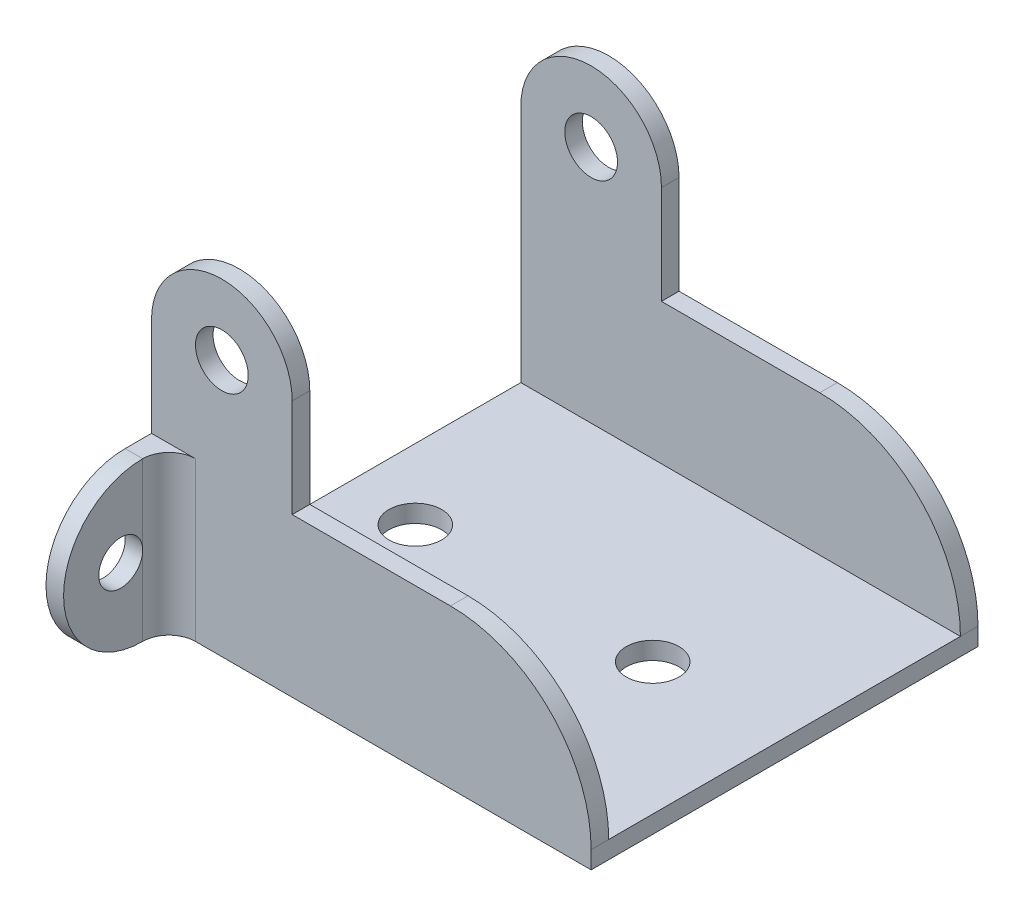
ISO-10303-21;
HEADER;
FILE_DESCRIPTION(('STEP AP214'),'2;1');
FILE_NAME('part.step','',(''),(''),'','','');
FILE_SCHEMA(('AUTOMOTIVE_DESIGN { 1 0 10303 214 1 1 1 1 }'));
ENDSEC;
DATA;
#1=APPLICATION_CONTEXT('core data for automotive mechanical design processes');
#2=APPLICATION_PROTOCOL_DEFINITION('international standard','automotive_design',2000,#1);
#3=PRODUCT_CONTEXT('',#1,'mechanical');
#4=PRODUCT('Part','Part','',(#3));
#5=PRODUCT_RELATED_PRODUCT_CATEGORY('part','',(#4));
#6=PRODUCT_DEFINITION_FORMATION('','',#4);
#7=PRODUCT_DEFINITION_CONTEXT('part definition',#1,'design');
#8=PRODUCT_DEFINITION('design','',#6,#7);
#9=PRODUCT_DEFINITION_SHAPE('','',#8);
#10=(LENGTH_UNIT() NAMED_UNIT(*) SI_UNIT(.MILLI.,.METRE.));
#11=(NAMED_UNIT(*) PLANE_ANGLE_UNIT() SI_UNIT($,.RADIAN.));
#12=(NAMED_UNIT(*) SI_UNIT($,.STERADIAN.) SOLID_ANGLE_UNIT());
#13=UNCERTAINTY_MEASURE_WITH_UNIT(LENGTH_MEASURE(1.E-05),#10,'distance_accuracy_value','');
#14=(GEOMETRIC_REPRESENTATION_CONTEXT(3) GLOBAL_UNCERTAINTY_ASSIGNED_CONTEXT((#13)) GLOBAL_UNIT_ASSIGNED_CONTEXT((#10,
#11,#12)) REPRESENTATION_CONTEXT('',''));
#15=CARTESIAN_POINT('',(0.,0.,0.));
#16=DIRECTION('',(0.,0.,1.));
#17=DIRECTION('',(1.,0.,0.));
#18=AXIS2_PLACEMENT_3D('',#15,#16,#17);
#19=CARTESIAN_POINT('',(-12.5,4.5,12.5));
#20=DIRECTION('',(-1.,0.,0.));
#21=DIRECTION('',(0.,0.,1.));
#22=AXIS2_PLACEMENT_3D('',#19,#20,#21);
#23=CYLINDRICAL_SURFACE('',#22,4.5);
#24=DIRECTION('',(-1.,0.,0.));
#25=VECTOR('',#24,1.);
#26=CARTESIAN_POINT('',(-12.5,9.,12.5));
#27=LINE('',#26,#25);
#28=CARTESIAN_POINT('',(-12.5,9.,12.5));
#29=VERTEX_POINT('',#28);
#30=CARTESIAN_POINT('',(-11.5,9.,12.5));
#31=VERTEX_POINT('',#30);
#32=EDGE_CURVE('E250',#29,#31,#27,.F.);
#33=ORIENTED_EDGE('',*,*,#32,.F.);
#34=CARTESIAN_POINT('',(-12.5,4.5,12.5));
#35=DIRECTION('',(1.,0.,0.));
#36=DIRECTION('',(0.,0.,-1.));
#37=AXIS2_PLACEMENT_3D('',#34,#35,#36);
#38=CIRCLE('',#37,4.5);
#39=CARTESIAN_POINT('',(-12.5,0.,12.5));
#40=VERTEX_POINT('',#39);
#41=EDGE_CURVE('E257',#40,#29,#38,.F.);
#42=ORIENTED_EDGE('',*,*,#41,.F.);
#43=DIRECTION('',(-1.,0.,0.));
#44=VECTOR('',#43,1.);
#45=CARTESIAN_POINT('',(0.,0.,12.5));
#46=LINE('',#45,#44);
#47=CARTESIAN_POINT('',(-11.5,0.,12.5));
#48=VERTEX_POINT('',#47);
#49=EDGE_CURVE('E253',#48,#40,#46,.T.);
#50=ORIENTED_EDGE('',*,*,#49,.F.);
#51=CARTESIAN_POINT('',(-11.5,4.5,12.5));
#52=DIRECTION('',(-1.,0.,0.));
#53=DIRECTION('',(0.,0.,1.));
#54=AXIS2_PLACEMENT_3D('',#51,#52,#53);
#55=CIRCLE('',#54,4.5);
#56=EDGE_CURVE('E259',#31,#48,#55,.F.);
#57=ORIENTED_EDGE('',*,*,#56,.F.);
#58=EDGE_LOOP('',(#33,#42,#50,#57));
#59=FACE_BOUND('',#58,.T.);
#60=ADVANCED_FACE('F38',(#59),#23,.T.);
#61=CARTESIAN_POINT('',(-12.5,1.,11.));
#62=DIRECTION('',(0.,0.,-1.));
#63=DIRECTION('',(-1.,0.,0.));
#64=AXIS2_PLACEMENT_3D('',#61,#62,#63);
#65=PLANE('',#64);
#66=CARTESIAN_POINT('',(-8.5,14.6,11.));
#67=DIRECTION('',(0.,0.,1.));
#68=DIRECTION('',(1.,0.,0.));
#69=AXIS2_PLACEMENT_3D('',#66,#67,#68);
#70=CIRCLE('',#69,1.5);
#71=CARTESIAN_POINT('',(-7.,14.6,11.));
#72=VERTEX_POINT('',#71);
#73=EDGE_CURVE('E392',#72,#72,#70,.T.);
#74=ORIENTED_EDGE('',*,*,#73,.F.);
#75=EDGE_LOOP('',(#74));
#76=FACE_BOUND('',#75,.T.);
#77=DIRECTION('',(-1.,0.,0.));
#78=VECTOR('',#77,1.);
#79=CARTESIAN_POINT('',(-12.5,9.,11.));
#80=LINE('',#79,#78);
#81=CARTESIAN_POINT('',(-10.,9.,11.));
#82=VERTEX_POINT('',#81);
#83=CARTESIAN_POINT('',(-12.5,9.,11.));
#84=VERTEX_POINT('',#83);
#85=EDGE_CURVE('E60',#82,#84,#80,.T.);
#86=ORIENTED_EDGE('',*,*,#85,.F.);
#87=DIRECTION('',(0.,1.,0.));
#88=VECTOR('',#87,1.);
#89=CARTESIAN_POINT('',(-10.,0.,11.));
#90=LINE('',#89,#88);
#91=CARTESIAN_POINT('',(-10.,0.,11.));
#92=VERTEX_POINT('',#91);
#93=EDGE_CURVE('E266',#82,#92,#90,.F.);
#94=ORIENTED_EDGE('',*,*,#93,.T.);
#95=DIRECTION('',(1.,0.,0.));
#96=VECTOR('',#95,1.);
#97=CARTESIAN_POINT('',(-12.5,0.,11.));
#98=LINE('',#97,#96);
#99=CARTESIAN_POINT('',(12.5,0.,11.));
#100=VERTEX_POINT('',#99);
#101=EDGE_CURVE('E267',#92,#100,#98,.T.);
#102=ORIENTED_EDGE('',*,*,#101,.T.);
#103=DIRECTION('',(0.,-1.,0.));
#104=VECTOR('',#103,1.);
#105=CARTESIAN_POINT('',(12.5,1.,11.));
#106=LINE('',#105,#104);
#107=CARTESIAN_POINT('',(12.5,1.,11.));
#108=VERTEX_POINT('',#107);
#109=EDGE_CURVE('E277',#108,#100,#106,.T.);
#110=ORIENTED_EDGE('',*,*,#109,.F.);
#111=CARTESIAN_POINT('',(4.50000000000001,1.,11.));
#112=DIRECTION('',(0.,0.,-1.));
#113=DIRECTION('',(-1.,0.,0.));
#114=AXIS2_PLACEMENT_3D('',#111,#112,#113);
#115=CIRCLE('',#114,8.);
#116=CARTESIAN_POINT('',(4.50000000000001,9.,11.));
#117=VERTEX_POINT('',#116);
#118=EDGE_CURVE('E254',#108,#117,#115,.F.);
#119=ORIENTED_EDGE('',*,*,#118,.T.);
#120=DIRECTION('',(1.,0.,0.));
#121=VECTOR('',#120,1.);
#122=CARTESIAN_POINT('',(0.,9.,11.));
#123=LINE('',#122,#121);
#124=CARTESIAN_POINT('',(-4.5,9.,11.));
#125=VERTEX_POINT('',#124);
#126=EDGE_CURVE('E317',#125,#117,#123,.T.);
#127=ORIENTED_EDGE('',*,*,#126,.F.);
#128=DIRECTION('',(0.,-1.,0.));
#129=VECTOR('',#128,1.);
#130=CARTESIAN_POINT('',(-4.5,18.6,11.));
#131=LINE('',#130,#129);
#132=CARTESIAN_POINT('',(-4.5,14.6,11.));
#133=VERTEX_POINT('',#132);
#134=EDGE_CURVE('E286',#133,#125,#131,.T.);
#135=ORIENTED_EDGE('',*,*,#134,.F.);
#136=CARTESIAN_POINT('',(-8.49999999999999,14.6,11.));
#137=DIRECTION('',(0.,0.,-1.));
#138=DIRECTION('',(-1.,0.,0.));
#139=AXIS2_PLACEMENT_3D('',#136,#137,#138);
#140=CIRCLE('',#139,4.);
#141=CARTESIAN_POINT('',(-12.5,14.6,11.));
#142=VERTEX_POINT('',#141);
#143=EDGE_CURVE('E303',#133,#142,#140,.F.);
#144=ORIENTED_EDGE('',*,*,#143,.T.);
#145=DIRECTION('',(0.,-1.,0.));
#146=VECTOR('',#145,1.);
#147=CARTESIAN_POINT('',(-12.5,1.,11.));
#148=LINE('',#147,#146);
#149=EDGE_CURVE('E243',#142,#84,#148,.T.);
#150=ORIENTED_EDGE('',*,*,#149,.T.);
#151=EDGE_LOOP('',(#86,#94,#102,#110,#119,#127,#135,#144,#150));
#152=FACE_BOUND('',#151,.T.);
#153=ADVANCED_FACE('F315',(#76,#152),#65,.F.);
#154=CARTESIAN_POINT('',(-8.49999999999999,14.6,10.));
#155=DIRECTION('',(0.,0.,-1.));
#156=DIRECTION('',(-1.,0.,0.));
#157=AXIS2_PLACEMENT_3D('',#154,#155,#156);
#158=CYLINDRICAL_SURFACE('',#157,4.);
#159=DIRECTION('',(0.,0.,1.));
#160=VECTOR('',#159,1.);
#161=CARTESIAN_POINT('',(-4.5,14.6,10.));
#162=LINE('',#161,#160);
#163=CARTESIAN_POINT('',(-4.5,14.6,10.));
#164=VERTEX_POINT('',#163);
#165=EDGE_CURVE('E292',#164,#133,#162,.T.);
#166=ORIENTED_EDGE('',*,*,#165,.F.);
#167=CARTESIAN_POINT('',(-8.49999999999999,14.6,10.));
#168=DIRECTION('',(0.,0.,-1.));
#169=DIRECTION('',(-1.,0.,0.));
#170=AXIS2_PLACEMENT_3D('',#167,#168,#169);
#171=CIRCLE('',#170,4.);
#172=CARTESIAN_POINT('',(-12.5,14.6,10.));
#173=VERTEX_POINT('',#172);
#174=EDGE_CURVE('E301',#173,#164,#171,.T.);
#175=ORIENTED_EDGE('',*,*,#174,.F.);
#176=DIRECTION('',(0.,0.,1.));
#177=VECTOR('',#176,1.);
#178=CARTESIAN_POINT('',(-12.5,14.6,10.));
#179=LINE('',#178,#177);
#180=EDGE_CURVE('E295',#142,#173,#179,.F.);
#181=ORIENTED_EDGE('',*,*,#180,.F.);
#182=ORIENTED_EDGE('',*,*,#143,.F.);
#183=EDGE_LOOP('',(#166,#175,#181,#182));
#184=FACE_BOUND('',#183,.T.);
#185=ADVANCED_FACE('F381',(#184),#158,.T.);
#186=CARTESIAN_POINT('',(0.,1.,0.));
#187=DIRECTION('',(0.,1.,0.));
#188=DIRECTION('',(0.,0.,1.));
#189=AXIS2_PLACEMENT_3D('',#186,#187,#188);
#190=PLANE('',#189);
#191=CARTESIAN_POINT('',(-8.5,1.,0.));
#192=DIRECTION('',(0.,1.,0.));
#193=DIRECTION('',(0.,0.,1.));
#194=AXIS2_PLACEMENT_3D('',#191,#192,#193);
#195=CIRCLE('',#194,1.5);
#196=CARTESIAN_POINT('',(-8.5,1.,1.49999999999999));
#197=VERTEX_POINT('',#196);
#198=EDGE_CURVE('E249',#197,#197,#195,.T.);
#199=ORIENTED_EDGE('',*,*,#198,.F.);
#200=EDGE_LOOP('',(#199));
#201=FACE_BOUND('',#200,.T.);
#202=CARTESIAN_POINT('',(5.,1.,0.));
#203=DIRECTION('',(0.,1.,0.));
#204=DIRECTION('',(0.,0.,1.));
#205=AXIS2_PLACEMENT_3D('',#202,#203,#204);
#206=CIRCLE('',#205,1.5);
#207=CARTESIAN_POINT('',(5.,1.,1.49999999999999));
#208=VERTEX_POINT('',#207);
#209=EDGE_CURVE('E396',#208,#208,#206,.T.);
#210=ORIENTED_EDGE('',*,*,#209,.F.);
#211=EDGE_LOOP('',(#210));
#212=FACE_BOUND('',#211,.T.);
#213=DIRECTION('',(1.,0.,0.));
#214=VECTOR('',#213,1.);
#215=CARTESIAN_POINT('',(0.,1.,-10.));
#216=LINE('',#215,#214);
#217=CARTESIAN_POINT('',(-12.5,1.,-10.));
#218=VERTEX_POINT('',#217);
#219=CARTESIAN_POINT('',(12.5,1.,-10.));
#220=VERTEX_POINT('',#219);
#221=EDGE_CURVE('E207',#218,#220,#216,.T.);
#222=ORIENTED_EDGE('',*,*,#221,.F.);
#223=DIRECTION('',(0.,0.,1.));
#224=VECTOR('',#223,1.);
#225=CARTESIAN_POINT('',(-12.5,1.,-11.));
#226=LINE('',#225,#224);
#227=CARTESIAN_POINT('',(-12.5,1.,10.));
#228=VERTEX_POINT('',#227);
#229=EDGE_CURVE('E42',#218,#228,#226,.T.);
#230=ORIENTED_EDGE('',*,*,#229,.T.);
#231=DIRECTION('',(1.,0.,0.));
#232=VECTOR('',#231,1.);
#233=CARTESIAN_POINT('',(0.,1.,10.));
#234=LINE('',#233,#232);
#235=CARTESIAN_POINT('',(12.5,1.,10.));
#236=VERTEX_POINT('',#235);
#237=EDGE_CURVE('E290',#228,#236,#234,.T.);
#238=ORIENTED_EDGE('',*,*,#237,.T.);
#239=DIRECTION('',(0.,0.,-1.));
#240=VECTOR('',#239,1.);
#241=CARTESIAN_POINT('',(12.5,1.,-11.));
#242=LINE('',#241,#240);
#243=EDGE_CURVE('E270',#236,#220,#242,.T.);
#244=ORIENTED_EDGE('',*,*,#243,.T.);
#245=EDGE_LOOP('',(#222,#230,#238,#244));
#246=FACE_BOUND('',#245,.T.);
#247=ADVANCED_FACE('F339',(#201,#212,#246),#190,.T.);
#248=CARTESIAN_POINT('',(12.5,1.,-11.));
#249=DIRECTION('',(-1.,0.,0.));
#250=DIRECTION('',(0.,0.,1.));
#251=AXIS2_PLACEMENT_3D('',#248,#249,#250);
#252=PLANE('',#251);
#253=DIRECTION('',(0.,0.,-1.));
#254=VECTOR('',#253,1.);
#255=CARTESIAN_POINT('',(12.5,0.,-11.));
#256=LINE('',#255,#254);
#257=CARTESIAN_POINT('',(12.5,0.,-11.));
#258=VERTEX_POINT('',#257);
#259=EDGE_CURVE('E288',#100,#258,#256,.T.);
#260=ORIENTED_EDGE('',*,*,#259,.T.);
#261=DIRECTION('',(0.,-1.,0.));
#262=VECTOR('',#261,1.);
#263=CARTESIAN_POINT('',(12.5,1.,-11.));
#264=LINE('',#263,#262);
#265=CARTESIAN_POINT('',(12.5,1.,-11.));
#266=VERTEX_POINT('',#265);
#267=EDGE_CURVE('E215',#266,#258,#264,.T.);
#268=ORIENTED_EDGE('',*,*,#267,.F.);
#269=DIRECTION('',(0.,0.,1.));
#270=VECTOR('',#269,1.);
#271=CARTESIAN_POINT('',(12.5,1.,-11.));
#272=LINE('',#271,#270);
#273=EDGE_CURVE('E344',#220,#266,#272,.F.);
#274=ORIENTED_EDGE('',*,*,#273,.F.);
#275=ORIENTED_EDGE('',*,*,#243,.F.);
#276=DIRECTION('',(0.,0.,-1.));
#277=VECTOR('',#276,1.);
#278=CARTESIAN_POINT('',(12.5,1.,11.));
#279=LINE('',#278,#277);
#280=EDGE_CURVE('E305',#236,#108,#279,.F.);
#281=ORIENTED_EDGE('',*,*,#280,.T.);
#282=ORIENTED_EDGE('',*,*,#109,.T.);
#283=EDGE_LOOP('',(#260,#268,#274,#275,#281,#282));
#284=FACE_BOUND('',#283,.T.);
#285=ADVANCED_FACE('F342',(#284),#252,.F.);
#286=CARTESIAN_POINT('',(-12.5,1.,-11.));
#287=DIRECTION('',(1.,0.,0.));
#288=DIRECTION('',(0.,0.,-1.));
#289=AXIS2_PLACEMENT_3D('',#286,#287,#288);
#290=PLANE('',#289);
#291=CARTESIAN_POINT('',(-12.5,4.5,13.75));
#292=DIRECTION('',(-1.,0.,0.));
#293=DIRECTION('',(0.,0.,1.));
#294=AXIS2_PLACEMENT_3D('',#291,#292,#293);
#295=CIRCLE('',#294,1.25);
#296=CARTESIAN_POINT('',(-12.5,4.5,15.));
#297=VERTEX_POINT('',#296);
#298=EDGE_CURVE('E231',#297,#297,#295,.T.);
#299=ORIENTED_EDGE('',*,*,#298,.F.);
#300=EDGE_LOOP('',(#299));
#301=FACE_BOUND('',#300,.T.);
#302=ORIENTED_EDGE('',*,*,#229,.F.);
#303=DIRECTION('',(0.,-1.,0.));
#304=VECTOR('',#303,1.);
#305=CARTESIAN_POINT('',(-12.5,18.6,-10.));
#306=LINE('',#305,#304);
#307=CARTESIAN_POINT('',(-12.5,14.6,-10.));
#308=VERTEX_POINT('',#307);
#309=EDGE_CURVE('E202',#308,#218,#306,.T.);
#310=ORIENTED_EDGE('',*,*,#309,.F.);
#311=DIRECTION('',(0.,0.,-1.));
#312=VECTOR('',#311,1.);
#313=CARTESIAN_POINT('',(-12.5,14.6,-10.));
#314=LINE('',#313,#312);
#315=CARTESIAN_POINT('',(-12.5,14.6,-11.));
#316=VERTEX_POINT('',#315);
#317=EDGE_CURVE('E830',#316,#308,#314,.F.);
#318=ORIENTED_EDGE('',*,*,#317,.F.);
#319=DIRECTION('',(0.,-1.,0.));
#320=VECTOR('',#319,1.);
#321=CARTESIAN_POINT('',(-12.5,1.,-11.));
#322=LINE('',#321,#320);
#323=CARTESIAN_POINT('',(-12.5,9.,-11.));
#324=VERTEX_POINT('',#323);
#325=EDGE_CURVE('E813',#316,#324,#322,.T.);
#326=ORIENTED_EDGE('',*,*,#325,.T.);
#327=DIRECTION('',(0.,0.,1.));
#328=VECTOR('',#327,1.);
#329=CARTESIAN_POINT('',(-12.5,9.,-17.));
#330=LINE('',#329,#328);
#331=CARTESIAN_POINT('',(-12.5,9.,-12.5));
#332=VERTEX_POINT('',#331);
#333=EDGE_CURVE('E805',#332,#324,#330,.T.);
#334=ORIENTED_EDGE('',*,*,#333,.F.);
#335=CARTESIAN_POINT('',(-12.5,4.5,-12.5));
#336=DIRECTION('',(-1.,0.,0.));
#337=DIRECTION('',(0.,0.,1.));
#338=AXIS2_PLACEMENT_3D('',#335,#336,#337);
#339=CIRCLE('',#338,4.5);
#340=CARTESIAN_POINT('',(-12.5,0.,-12.5));
#341=VERTEX_POINT('',#340);
#342=EDGE_CURVE('E356',#341,#332,#339,.F.);
#343=ORIENTED_EDGE('',*,*,#342,.F.);
#344=DIRECTION('',(0.,0.,1.));
#345=VECTOR('',#344,1.);
#346=CARTESIAN_POINT('',(-12.5,0.,-11.));
#347=LINE('',#346,#345);
#348=EDGE_CURVE('E271',#341,#40,#347,.T.);
#349=ORIENTED_EDGE('',*,*,#348,.T.);
#350=ORIENTED_EDGE('',*,*,#41,.T.);
#351=DIRECTION('',(0.,0.,-1.));
#352=VECTOR('',#351,1.);
#353=CARTESIAN_POINT('',(-12.5,9.,17.));
#354=LINE('',#353,#352);
#355=EDGE_CURVE('E242',#29,#84,#354,.T.);
#356=ORIENTED_EDGE('',*,*,#355,.T.);
#357=ORIENTED_EDGE('',*,*,#149,.F.);
#358=ORIENTED_EDGE('',*,*,#180,.T.);
#359=DIRECTION('',(0.,-1.,0.));
#360=VECTOR('',#359,1.);
#361=CARTESIAN_POINT('',(-12.5,18.6,10.));
#362=LINE('',#361,#360);
#363=EDGE_CURVE('E296',#173,#228,#362,.T.);
#364=ORIENTED_EDGE('',*,*,#363,.T.);
#365=EDGE_LOOP('',(#302,#310,#318,#326,#334,#343,#349,#350,#356,#357,#358,#364));
#366=FACE_BOUND('',#365,.T.);
#367=CARTESIAN_POINT('',(-12.5,4.5,-13.75));
#368=DIRECTION('',(1.,0.,0.));
#369=DIRECTION('',(0.,0.,-1.));
#370=AXIS2_PLACEMENT_3D('',#367,#368,#369);
#371=CIRCLE('',#370,1.25);
#372=CARTESIAN_POINT('',(-12.5,4.5,-15.));
#373=VERTEX_POINT('',#372);
#374=EDGE_CURVE('E782',#373,#373,#371,.T.);
#375=ORIENTED_EDGE('',*,*,#374,.T.);
#376=EDGE_LOOP('',(#375));
#377=FACE_BOUND('',#376,.T.);
#378=ADVANCED_FACE('F352',(#301,#366,#377),#290,.F.);
#379=CARTESIAN_POINT('',(0.,0.,0.));
#380=DIRECTION('',(0.,1.,0.));
#381=DIRECTION('',(0.,0.,1.));
#382=AXIS2_PLACEMENT_3D('',#379,#380,#381);
#383=PLANE('',#382);
#384=ORIENTED_EDGE('',*,*,#348,.F.);
#385=DIRECTION('',(-1.,0.,0.));
#386=VECTOR('',#385,1.);
#387=CARTESIAN_POINT('',(0.,0.,-12.5));
#388=LINE('',#387,#386);
#389=CARTESIAN_POINT('',(-11.5,0.,-12.5));
#390=VERTEX_POINT('',#389);
#391=EDGE_CURVE('E797',#390,#341,#388,.T.);
#392=ORIENTED_EDGE('',*,*,#391,.F.);
#393=CARTESIAN_POINT('',(-10.,0.,-12.5));
#394=DIRECTION('',(0.,-1.,0.));
#395=DIRECTION('',(0.,0.,-1.));
#396=AXIS2_PLACEMENT_3D('',#393,#394,#395);
#397=CIRCLE('',#396,1.5);
#398=CARTESIAN_POINT('',(-10.,0.,-11.));
#399=VERTEX_POINT('',#398);
#400=EDGE_CURVE('E228',#399,#390,#397,.T.);
#401=ORIENTED_EDGE('',*,*,#400,.F.);
#402=DIRECTION('',(1.,0.,0.));
#403=VECTOR('',#402,1.);
#404=CARTESIAN_POINT('',(-12.5,0.,-11.));
#405=LINE('',#404,#403);
#406=EDGE_CURVE('E204',#399,#258,#405,.T.);
#407=ORIENTED_EDGE('',*,*,#406,.T.);
#408=ORIENTED_EDGE('',*,*,#259,.F.);
#409=ORIENTED_EDGE('',*,*,#101,.F.);
#410=CARTESIAN_POINT('',(-10.,0.,12.5));
#411=DIRECTION('',(0.,1.,0.));
#412=DIRECTION('',(0.,0.,1.));
#413=AXIS2_PLACEMENT_3D('',#410,#411,#412);
#414=CIRCLE('',#413,1.5);
#415=EDGE_CURVE('E11',#92,#48,#414,.T.);
#416=ORIENTED_EDGE('',*,*,#415,.T.);
#417=ORIENTED_EDGE('',*,*,#49,.T.);
#418=EDGE_LOOP('',(#384,#392,#401,#407,#408,#409,#416,#417));
#419=FACE_BOUND('',#418,.T.);
#420=CARTESIAN_POINT('',(-8.5,0.,0.));
#421=DIRECTION('',(0.,1.,0.));
#422=DIRECTION('',(0.,0.,1.));
#423=AXIS2_PLACEMENT_3D('',#420,#421,#422);
#424=CIRCLE('',#423,1.5);
#425=CARTESIAN_POINT('',(-8.5,0.,1.49999999999999));
#426=VERTEX_POINT('',#425);
#427=EDGE_CURVE('E237',#426,#426,#424,.T.);
#428=ORIENTED_EDGE('',*,*,#427,.T.);
#429=EDGE_LOOP('',(#428));
#430=FACE_BOUND('',#429,.T.);
#431=CARTESIAN_POINT('',(5.,0.,0.));
#432=DIRECTION('',(0.,1.,0.));
#433=DIRECTION('',(0.,0.,1.));
#434=AXIS2_PLACEMENT_3D('',#431,#432,#433);
#435=CIRCLE('',#434,1.5);
#436=CARTESIAN_POINT('',(5.,0.,1.49999999999999));
#437=VERTEX_POINT('',#436);
#438=EDGE_CURVE('E395',#437,#437,#435,.T.);
#439=ORIENTED_EDGE('',*,*,#438,.T.);
#440=EDGE_LOOP('',(#439));
#441=FACE_BOUND('',#440,.T.);
#442=ADVANCED_FACE('F365',(#419,#430,#441),#383,.F.);
#443=CARTESIAN_POINT('',(-4.5,18.6,0.));
#444=DIRECTION('',(-1.,0.,0.));
#445=DIRECTION('',(0.,0.,1.));
#446=AXIS2_PLACEMENT_3D('',#443,#444,#445);
#447=PLANE('',#446);
#448=DIRECTION('',(0.,-1.,0.));
#449=VECTOR('',#448,1.);
#450=CARTESIAN_POINT('',(-4.5,18.6,10.));
#451=LINE('',#450,#449);
#452=CARTESIAN_POINT('',(-4.5,9.,10.));
#453=VERTEX_POINT('',#452);
#454=EDGE_CURVE('E289',#164,#453,#451,.T.);
#455=ORIENTED_EDGE('',*,*,#454,.F.);
#456=ORIENTED_EDGE('',*,*,#165,.T.);
#457=ORIENTED_EDGE('',*,*,#134,.T.);
#458=DIRECTION('',(0.,0.,-1.));
#459=VECTOR('',#458,1.);
#460=CARTESIAN_POINT('',(-4.5,9.,0.));
#461=LINE('',#460,#459);
#462=EDGE_CURVE('E327',#125,#453,#461,.T.);
#463=ORIENTED_EDGE('',*,*,#462,.T.);
#464=EDGE_LOOP('',(#455,#456,#457,#463));
#465=FACE_BOUND('',#464,.T.);
#466=ADVANCED_FACE('F384',(#465),#447,.F.);
#467=CARTESIAN_POINT('',(0.,18.6,10.));
#468=DIRECTION('',(0.,0.,-1.));
#469=DIRECTION('',(-1.,0.,0.));
#470=AXIS2_PLACEMENT_3D('',#467,#468,#469);
#471=PLANE('',#470);
#472=CARTESIAN_POINT('',(-8.5,14.6,10.));
#473=DIRECTION('',(0.,0.,-1.));
#474=DIRECTION('',(-1.,0.,0.));
#475=AXIS2_PLACEMENT_3D('',#472,#473,#474);
#476=CIRCLE('',#475,1.5);
#477=CARTESIAN_POINT('',(-10.,14.6,10.));
#478=VERTEX_POINT('',#477);
#479=EDGE_CURVE('E386',#478,#478,#476,.T.);
#480=ORIENTED_EDGE('',*,*,#479,.F.);
#481=EDGE_LOOP('',(#480));
#482=FACE_BOUND('',#481,.T.);
#483=DIRECTION('',(1.,0.,0.));
#484=VECTOR('',#483,1.);
#485=CARTESIAN_POINT('',(0.,9.,10.));
#486=LINE('',#485,#484);
#487=CARTESIAN_POINT('',(4.50000000000001,9.,10.));
#488=VERTEX_POINT('',#487);
#489=EDGE_CURVE('E335',#453,#488,#486,.T.);
#490=ORIENTED_EDGE('',*,*,#489,.T.);
#491=CARTESIAN_POINT('',(4.50000000000001,1.,10.));
#492=DIRECTION('',(0.,0.,-1.));
#493=DIRECTION('',(-1.,0.,0.));
#494=AXIS2_PLACEMENT_3D('',#491,#492,#493);
#495=CIRCLE('',#494,8.);
#496=EDGE_CURVE('E310',#488,#236,#495,.T.);
#497=ORIENTED_EDGE('',*,*,#496,.T.);
#498=ORIENTED_EDGE('',*,*,#237,.F.);
#499=ORIENTED_EDGE('',*,*,#363,.F.);
#500=ORIENTED_EDGE('',*,*,#174,.T.);
#501=ORIENTED_EDGE('',*,*,#454,.T.);
#502=EDGE_LOOP('',(#490,#497,#498,#499,#500,#501));
#503=FACE_BOUND('',#502,.T.);
#504=ADVANCED_FACE('F333',(#482,#503),#471,.T.);
#505=CARTESIAN_POINT('',(0.,9.,0.));
#506=DIRECTION('',(0.,1.,0.));
#507=DIRECTION('',(0.,0.,1.));
#508=AXIS2_PLACEMENT_3D('',#505,#506,#507);
#509=PLANE('',#508);
#510=ORIENTED_EDGE('',*,*,#126,.T.);
#511=DIRECTION('',(0.,0.,-1.));
#512=VECTOR('',#511,1.);
#513=CARTESIAN_POINT('',(4.50000000000001,9.,10.));
#514=LINE('',#513,#512);
#515=EDGE_CURVE('E307',#117,#488,#514,.T.);
#516=ORIENTED_EDGE('',*,*,#515,.T.);
#517=ORIENTED_EDGE('',*,*,#489,.F.);
#518=ORIENTED_EDGE('',*,*,#462,.F.);
#519=EDGE_LOOP('',(#510,#516,#517,#518));
#520=FACE_BOUND('',#519,.T.);
#521=ADVANCED_FACE('F323',(#520),#509,.T.);
#522=CARTESIAN_POINT('',(4.5,1.,0.));
#523=DIRECTION('',(0.,0.,1.));
#524=DIRECTION('',(1.,0.,0.));
#525=AXIS2_PLACEMENT_3D('',#522,#523,#524);
#526=CYLINDRICAL_SURFACE('',#525,8.);
#527=ORIENTED_EDGE('',*,*,#118,.F.);
#528=ORIENTED_EDGE('',*,*,#280,.F.);
#529=ORIENTED_EDGE('',*,*,#496,.F.);
#530=ORIENTED_EDGE('',*,*,#515,.F.);
#531=EDGE_LOOP('',(#527,#528,#529,#530));
#532=FACE_BOUND('',#531,.T.);
#533=ADVANCED_FACE('F329',(#532),#526,.T.);
#534=CARTESIAN_POINT('',(-8.5,14.6,-11.));
#535=DIRECTION('',(0.,0.,1.));
#536=DIRECTION('',(1.,0.,0.));
#537=AXIS2_PLACEMENT_3D('',#534,#535,#536);
#538=CYLINDRICAL_SURFACE('',#537,1.5);
#539=ORIENTED_EDGE('',*,*,#479,.T.);
#540=EDGE_LOOP('',(#539));
#541=FACE_BOUND('',#540,.T.);
#542=ORIENTED_EDGE('',*,*,#73,.T.);
#543=EDGE_LOOP('',(#542));
#544=FACE_BOUND('',#543,.T.);
#545=ADVANCED_FACE('F416',(#541,#544),#538,.F.);
#546=CARTESIAN_POINT('',(5.,0.,0.));
#547=DIRECTION('',(0.,1.,0.));
#548=DIRECTION('',(0.,0.,1.));
#549=AXIS2_PLACEMENT_3D('',#546,#547,#548);
#550=CYLINDRICAL_SURFACE('',#549,1.5);
#551=ORIENTED_EDGE('',*,*,#209,.T.);
#552=EDGE_LOOP('',(#551));
#553=FACE_BOUND('',#552,.T.);
#554=ORIENTED_EDGE('',*,*,#438,.F.);
#555=EDGE_LOOP('',(#554));
#556=FACE_BOUND('',#555,.T.);
#557=ADVANCED_FACE('F409',(#553,#556),#550,.F.);
#558=CARTESIAN_POINT('',(-8.5,0.,0.));
#559=DIRECTION('',(0.,1.,0.));
#560=DIRECTION('',(0.,0.,1.));
#561=AXIS2_PLACEMENT_3D('',#558,#559,#560);
#562=CYLINDRICAL_SURFACE('',#561,1.5);
#563=ORIENTED_EDGE('',*,*,#198,.T.);
#564=EDGE_LOOP('',(#563));
#565=FACE_BOUND('',#564,.T.);
#566=ORIENTED_EDGE('',*,*,#427,.F.);
#567=EDGE_LOOP('',(#566));
#568=FACE_BOUND('',#567,.T.);
#569=ADVANCED_FACE('F407',(#565,#568),#562,.F.);
#570=CARTESIAN_POINT('',(-11.5,0.,17.));
#571=DIRECTION('',(-1.,0.,0.));
#572=DIRECTION('',(0.,0.,1.));
#573=AXIS2_PLACEMENT_3D('',#570,#571,#572);
#574=PLANE('',#573);
#575=DIRECTION('',(0.,1.,0.));
#576=VECTOR('',#575,1.);
#577=CARTESIAN_POINT('',(-11.5,9.,12.5));
#578=LINE('',#577,#576);
#579=CARTESIAN_POINT('',(-11.5,4.5,12.5));
#580=VERTEX_POINT('',#579);
#581=EDGE_CURVE('E263',#48,#580,#578,.T.);
#582=ORIENTED_EDGE('',*,*,#581,.T.);
#583=CARTESIAN_POINT('',(-11.5,4.5,13.75));
#584=DIRECTION('',(-1.,0.,0.));
#585=DIRECTION('',(0.,0.,1.));
#586=AXIS2_PLACEMENT_3D('',#583,#584,#585);
#587=CIRCLE('',#586,1.25);
#588=EDGE_CURVE('E53',#580,#580,#587,.F.);
#589=ORIENTED_EDGE('',*,*,#588,.F.);
#590=EDGE_CURVE('E262',#580,#31,#578,.T.);
#591=ORIENTED_EDGE('',*,*,#590,.T.);
#592=ORIENTED_EDGE('',*,*,#56,.T.);
#593=EDGE_LOOP('',(#582,#589,#591,#592));
#594=FACE_BOUND('',#593,.T.);
#595=ADVANCED_FACE('F372',(#594),#574,.F.);
#596=CARTESIAN_POINT('',(-12.5,9.,17.));
#597=DIRECTION('',(0.,-1.,0.));
#598=DIRECTION('',(0.,0.,-1.));
#599=AXIS2_PLACEMENT_3D('',#596,#597,#598);
#600=PLANE('',#599);
#601=ORIENTED_EDGE('',*,*,#355,.F.);
#602=ORIENTED_EDGE('',*,*,#32,.T.);
#603=CARTESIAN_POINT('',(-10.,9.,12.5));
#604=DIRECTION('',(0.,-1.,0.));
#605=DIRECTION('',(0.,0.,-1.));
#606=AXIS2_PLACEMENT_3D('',#603,#604,#605);
#607=CIRCLE('',#606,1.5);
#608=EDGE_CURVE('E48',#31,#82,#607,.T.);
#609=ORIENTED_EDGE('',*,*,#608,.T.);
#610=ORIENTED_EDGE('',*,*,#85,.T.);
#611=EDGE_LOOP('',(#601,#602,#609,#610));
#612=FACE_BOUND('',#611,.T.);
#613=ADVANCED_FACE('F376',(#612),#600,.F.);
#614=CARTESIAN_POINT('',(-10.,0.,12.5));
#615=DIRECTION('',(0.,-1.,0.));
#616=DIRECTION('',(0.,0.,-1.));
#617=AXIS2_PLACEMENT_3D('',#614,#615,#616);
#618=CYLINDRICAL_SURFACE('',#617,1.5);
#619=ORIENTED_EDGE('',*,*,#415,.F.);
#620=ORIENTED_EDGE('',*,*,#93,.F.);
#621=ORIENTED_EDGE('',*,*,#608,.F.);
#622=ORIENTED_EDGE('',*,*,#590,.F.);
#623=ORIENTED_EDGE('',*,*,#581,.F.);
#624=EDGE_LOOP('',(#619,#620,#621,#622,#623));
#625=FACE_BOUND('',#624,.T.);
#626=ADVANCED_FACE('F40',(#625),#618,.F.);
#627=CARTESIAN_POINT('',(12.501,4.5,13.75));
#628=DIRECTION('',(-1.,0.,0.));
#629=DIRECTION('',(0.,0.,1.));
#630=AXIS2_PLACEMENT_3D('',#627,#628,#629);
#631=CYLINDRICAL_SURFACE('',#630,1.25);
#632=ORIENTED_EDGE('',*,*,#298,.T.);
#633=EDGE_LOOP('',(#632));
#634=FACE_BOUND('',#633,.T.);
#635=ORIENTED_EDGE('',*,*,#588,.T.);
#636=EDGE_LOOP('',(#635));
#637=FACE_BOUND('',#636,.T.);
#638=ADVANCED_FACE('F484',(#634,#637),#631,.F.);
#639=CARTESIAN_POINT('',(-12.5,4.5,-12.5));
#640=DIRECTION('',(-1.,0.,0.));
#641=DIRECTION('',(0.,0.,-1.));
#642=AXIS2_PLACEMENT_3D('',#639,#640,#641);
#643=CYLINDRICAL_SURFACE('',#642,4.5);
#644=DIRECTION('',(-1.,0.,0.));
#645=VECTOR('',#644,1.);
#646=CARTESIAN_POINT('',(-12.5,9.,-12.5));
#647=LINE('',#646,#645);
#648=CARTESIAN_POINT('',(-11.5,9.,-12.5));
#649=VERTEX_POINT('',#648);
#650=EDGE_CURVE('E798',#332,#649,#647,.F.);
#651=ORIENTED_EDGE('',*,*,#650,.T.);
#652=CARTESIAN_POINT('',(-11.5,4.5,-12.5));
#653=DIRECTION('',(1.,0.,0.));
#654=DIRECTION('',(0.,0.,-1.));
#655=AXIS2_PLACEMENT_3D('',#652,#653,#654);
#656=CIRCLE('',#655,4.5);
#657=EDGE_CURVE('E793',#649,#390,#656,.F.);
#658=ORIENTED_EDGE('',*,*,#657,.T.);
#659=ORIENTED_EDGE('',*,*,#391,.T.);
#660=ORIENTED_EDGE('',*,*,#342,.T.);
#661=EDGE_LOOP('',(#651,#658,#659,#660));
#662=FACE_BOUND('',#661,.T.);
#663=ADVANCED_FACE('F479',(#662),#643,.T.);
#664=CARTESIAN_POINT('',(-12.5,1.,-11.));
#665=DIRECTION('',(0.,0.,1.));
#666=DIRECTION('',(-1.,0.,0.));
#667=AXIS2_PLACEMENT_3D('',#664,#665,#666);
#668=PLANE('',#667);
#669=CARTESIAN_POINT('',(-8.5,14.6,-11.));
#670=DIRECTION('',(0.,0.,1.));
#671=DIRECTION('',(1.,0.,0.));
#672=AXIS2_PLACEMENT_3D('',#669,#670,#671);
#673=CIRCLE('',#672,1.5);
#674=CARTESIAN_POINT('',(-7.,14.6,-11.));
#675=VERTEX_POINT('',#674);
#676=EDGE_CURVE('E807',#675,#675,#673,.T.);
#677=ORIENTED_EDGE('',*,*,#676,.T.);
#678=EDGE_LOOP('',(#677));
#679=FACE_BOUND('',#678,.T.);
#680=DIRECTION('',(-1.,0.,0.));
#681=VECTOR('',#680,1.);
#682=CARTESIAN_POINT('',(-12.5,9.,-11.));
#683=LINE('',#682,#681);
#684=CARTESIAN_POINT('',(-10.,9.,-11.));
#685=VERTEX_POINT('',#684);
#686=EDGE_CURVE('E786',#685,#324,#683,.T.);
#687=ORIENTED_EDGE('',*,*,#686,.T.);
#688=ORIENTED_EDGE('',*,*,#325,.F.);
#689=CARTESIAN_POINT('',(-8.49999999999999,14.6,-11.));
#690=DIRECTION('',(0.,0.,-1.));
#691=DIRECTION('',(-1.,0.,0.));
#692=AXIS2_PLACEMENT_3D('',#689,#690,#691);
#693=CIRCLE('',#692,4.);
#694=CARTESIAN_POINT('',(-4.5,14.6,-11.));
#695=VERTEX_POINT('',#694);
#696=EDGE_CURVE('E836',#695,#316,#693,.F.);
#697=ORIENTED_EDGE('',*,*,#696,.F.);
#698=DIRECTION('',(0.,-1.,0.));
#699=VECTOR('',#698,1.);
#700=CARTESIAN_POINT('',(-4.5,18.6,-11.));
#701=LINE('',#700,#699);
#702=CARTESIAN_POINT('',(-4.5,9.,-11.));
#703=VERTEX_POINT('',#702);
#704=EDGE_CURVE('E201',#695,#703,#701,.T.);
#705=ORIENTED_EDGE('',*,*,#704,.T.);
#706=DIRECTION('',(1.,0.,0.));
#707=VECTOR('',#706,1.);
#708=CARTESIAN_POINT('',(0.,9.,-11.));
#709=LINE('',#708,#707);
#710=CARTESIAN_POINT('',(4.50000000000001,9.,-11.));
#711=VERTEX_POINT('',#710);
#712=EDGE_CURVE('E193',#703,#711,#709,.T.);
#713=ORIENTED_EDGE('',*,*,#712,.T.);
#714=CARTESIAN_POINT('',(4.50000000000001,1.,-11.));
#715=DIRECTION('',(0.,0.,-1.));
#716=DIRECTION('',(-1.,0.,0.));
#717=AXIS2_PLACEMENT_3D('',#714,#715,#716);
#718=CIRCLE('',#717,8.);
#719=EDGE_CURVE('E804',#266,#711,#718,.F.);
#720=ORIENTED_EDGE('',*,*,#719,.F.);
#721=ORIENTED_EDGE('',*,*,#267,.T.);
#722=ORIENTED_EDGE('',*,*,#406,.F.);
#723=DIRECTION('',(0.,1.,0.));
#724=VECTOR('',#723,1.);
#725=CARTESIAN_POINT('',(-10.,0.,-11.));
#726=LINE('',#725,#724);
#727=EDGE_CURVE('E223',#685,#399,#726,.F.);
#728=ORIENTED_EDGE('',*,*,#727,.F.);
#729=EDGE_LOOP('',(#687,#688,#697,#705,#713,#720,#721,#722,#728));
#730=FACE_BOUND('',#729,.T.);
#731=ADVANCED_FACE('F483',(#679,#730),#668,.F.);
#732=CARTESIAN_POINT('',(-8.49999999999999,14.6,-10.));
#733=DIRECTION('',(0.,0.,1.));
#734=DIRECTION('',(-1.,0.,0.));
#735=AXIS2_PLACEMENT_3D('',#732,#733,#734);
#736=CYLINDRICAL_SURFACE('',#735,4.);
#737=DIRECTION('',(0.,0.,-1.));
#738=VECTOR('',#737,1.);
#739=CARTESIAN_POINT('',(-4.5,14.6,-10.));
#740=LINE('',#739,#738);
#741=CARTESIAN_POINT('',(-4.5,14.6,-10.));
#742=VERTEX_POINT('',#741);
#743=EDGE_CURVE('E200',#742,#695,#740,.T.);
#744=ORIENTED_EDGE('',*,*,#743,.T.);
#745=ORIENTED_EDGE('',*,*,#696,.T.);
#746=ORIENTED_EDGE('',*,*,#317,.T.);
#747=CARTESIAN_POINT('',(-8.49999999999999,14.6,-10.));
#748=DIRECTION('',(0.,0.,-1.));
#749=DIRECTION('',(-1.,0.,0.));
#750=AXIS2_PLACEMENT_3D('',#747,#748,#749);
#751=CIRCLE('',#750,4.);
#752=EDGE_CURVE('E834',#308,#742,#751,.T.);
#753=ORIENTED_EDGE('',*,*,#752,.T.);
#754=EDGE_LOOP('',(#744,#745,#746,#753));
#755=FACE_BOUND('',#754,.T.);
#756=ADVANCED_FACE('F496',(#755),#736,.T.);
#757=CARTESIAN_POINT('',(-4.5,18.6,0.));
#758=DIRECTION('',(-1.,0.,0.));
#759=DIRECTION('',(0.,0.,-1.));
#760=AXIS2_PLACEMENT_3D('',#757,#758,#759);
#761=PLANE('',#760);
#762=DIRECTION('',(0.,-1.,0.));
#763=VECTOR('',#762,1.);
#764=CARTESIAN_POINT('',(-4.5,18.6,-10.));
#765=LINE('',#764,#763);
#766=CARTESIAN_POINT('',(-4.5,9.,-10.));
#767=VERTEX_POINT('',#766);
#768=EDGE_CURVE('E181',#742,#767,#765,.T.);
#769=ORIENTED_EDGE('',*,*,#768,.T.);
#770=DIRECTION('',(0.,0.,1.));
#771=VECTOR('',#770,1.);
#772=CARTESIAN_POINT('',(-4.5,9.,0.));
#773=LINE('',#772,#771);
#774=EDGE_CURVE('E187',#703,#767,#773,.T.);
#775=ORIENTED_EDGE('',*,*,#774,.F.);
#776=ORIENTED_EDGE('',*,*,#704,.F.);
#777=ORIENTED_EDGE('',*,*,#743,.F.);
#778=EDGE_LOOP('',(#769,#775,#776,#777));
#779=FACE_BOUND('',#778,.T.);
#780=ADVANCED_FACE('F199',(#779),#761,.F.);
#781=CARTESIAN_POINT('',(0.,18.6,-10.));
#782=DIRECTION('',(0.,0.,1.));
#783=DIRECTION('',(-1.,0.,0.));
#784=AXIS2_PLACEMENT_3D('',#781,#782,#783);
#785=PLANE('',#784);
#786=CARTESIAN_POINT('',(-8.5,14.6,-10.));
#787=DIRECTION('',(0.,0.,-1.));
#788=DIRECTION('',(-1.,0.,0.));
#789=AXIS2_PLACEMENT_3D('',#786,#787,#788);
#790=CIRCLE('',#789,1.5);
#791=CARTESIAN_POINT('',(-10.,14.6,-10.));
#792=VERTEX_POINT('',#791);
#793=EDGE_CURVE('E188',#792,#792,#790,.T.);
#794=ORIENTED_EDGE('',*,*,#793,.T.);
#795=EDGE_LOOP('',(#794));
#796=FACE_BOUND('',#795,.T.);
#797=DIRECTION('',(1.,0.,0.));
#798=VECTOR('',#797,1.);
#799=CARTESIAN_POINT('',(0.,9.,-10.));
#800=LINE('',#799,#798);
#801=CARTESIAN_POINT('',(4.50000000000001,9.,-10.));
#802=VERTEX_POINT('',#801);
#803=EDGE_CURVE('E176',#767,#802,#800,.T.);
#804=ORIENTED_EDGE('',*,*,#803,.F.);
#805=ORIENTED_EDGE('',*,*,#768,.F.);
#806=ORIENTED_EDGE('',*,*,#752,.F.);
#807=ORIENTED_EDGE('',*,*,#309,.T.);
#808=ORIENTED_EDGE('',*,*,#221,.T.);
#809=CARTESIAN_POINT('',(4.50000000000001,1.,-10.));
#810=DIRECTION('',(0.,0.,-1.));
#811=DIRECTION('',(-1.,0.,0.));
#812=AXIS2_PLACEMENT_3D('',#809,#810,#811);
#813=CIRCLE('',#812,8.);
#814=EDGE_CURVE('E185',#802,#220,#813,.T.);
#815=ORIENTED_EDGE('',*,*,#814,.F.);
#816=EDGE_LOOP('',(#804,#805,#806,#807,#808,#815));
#817=FACE_BOUND('',#816,.T.);
#818=ADVANCED_FACE('F178',(#796,#817),#785,.T.);
#819=CARTESIAN_POINT('',(0.,9.,0.));
#820=DIRECTION('',(0.,1.,0.));
#821=DIRECTION('',(0.,0.,-1.));
#822=AXIS2_PLACEMENT_3D('',#819,#820,#821);
#823=PLANE('',#822);
#824=ORIENTED_EDGE('',*,*,#712,.F.);
#825=ORIENTED_EDGE('',*,*,#774,.T.);
#826=ORIENTED_EDGE('',*,*,#803,.T.);
#827=DIRECTION('',(0.,0.,1.));
#828=VECTOR('',#827,1.);
#829=CARTESIAN_POINT('',(4.50000000000001,9.,-10.));
#830=LINE('',#829,#828);
#831=EDGE_CURVE('E840',#711,#802,#830,.T.);
#832=ORIENTED_EDGE('',*,*,#831,.F.);
#833=EDGE_LOOP('',(#824,#825,#826,#832));
#834=FACE_BOUND('',#833,.T.);
#835=ADVANCED_FACE('F191',(#834),#823,.T.);
#836=CARTESIAN_POINT('',(4.5,1.,0.));
#837=DIRECTION('',(0.,0.,-1.));
#838=DIRECTION('',(1.,0.,0.));
#839=AXIS2_PLACEMENT_3D('',#836,#837,#838);
#840=CYLINDRICAL_SURFACE('',#839,8.);
#841=ORIENTED_EDGE('',*,*,#719,.T.);
#842=ORIENTED_EDGE('',*,*,#831,.T.);
#843=ORIENTED_EDGE('',*,*,#814,.T.);
#844=ORIENTED_EDGE('',*,*,#273,.T.);
#845=EDGE_LOOP('',(#841,#842,#843,#844));
#846=FACE_BOUND('',#845,.T.);
#847=ADVANCED_FACE('F535',(#846),#840,.T.);
#848=CARTESIAN_POINT('',(-8.5,14.6,11.));
#849=DIRECTION('',(0.,0.,-1.));
#850=DIRECTION('',(1.,0.,0.));
#851=AXIS2_PLACEMENT_3D('',#848,#849,#850);
#852=CYLINDRICAL_SURFACE('',#851,1.5);
#853=ORIENTED_EDGE('',*,*,#793,.F.);
#854=EDGE_LOOP('',(#853));
#855=FACE_BOUND('',#854,.T.);
#856=ORIENTED_EDGE('',*,*,#676,.F.);
#857=EDGE_LOOP('',(#856));
#858=FACE_BOUND('',#857,.T.);
#859=ADVANCED_FACE('F544',(#855,#858),#852,.F.);
#860=CARTESIAN_POINT('',(-11.5,0.,-17.));
#861=DIRECTION('',(-1.,0.,0.));
#862=DIRECTION('',(0.,0.,-1.));
#863=AXIS2_PLACEMENT_3D('',#860,#861,#862);
#864=PLANE('',#863);
#865=DIRECTION('',(0.,1.,0.));
#866=VECTOR('',#865,1.);
#867=CARTESIAN_POINT('',(-11.5,9.,-12.5));
#868=LINE('',#867,#866);
#869=CARTESIAN_POINT('',(-11.5,4.5,-12.5));
#870=VERTEX_POINT('',#869);
#871=EDGE_CURVE('E221',#390,#870,#868,.T.);
#872=ORIENTED_EDGE('',*,*,#871,.F.);
#873=ORIENTED_EDGE('',*,*,#657,.F.);
#874=EDGE_CURVE('E790',#870,#649,#868,.T.);
#875=ORIENTED_EDGE('',*,*,#874,.F.);
#876=CARTESIAN_POINT('',(-11.5,4.5,-13.75));
#877=DIRECTION('',(1.,0.,0.));
#878=DIRECTION('',(0.,0.,-1.));
#879=AXIS2_PLACEMENT_3D('',#876,#877,#878);
#880=CIRCLE('',#879,1.25);
#881=EDGE_CURVE('E784',#870,#870,#880,.F.);
#882=ORIENTED_EDGE('',*,*,#881,.T.);
#883=EDGE_LOOP('',(#872,#873,#875,#882));
#884=FACE_BOUND('',#883,.T.);
#885=ADVANCED_FACE('F554',(#884),#864,.F.);
#886=CARTESIAN_POINT('',(-12.5,9.,-17.));
#887=DIRECTION('',(0.,-1.,0.));
#888=DIRECTION('',(0.,0.,1.));
#889=AXIS2_PLACEMENT_3D('',#886,#887,#888);
#890=PLANE('',#889);
#891=ORIENTED_EDGE('',*,*,#333,.T.);
#892=ORIENTED_EDGE('',*,*,#686,.F.);
#893=CARTESIAN_POINT('',(-10.,9.,-12.5));
#894=DIRECTION('',(0.,1.,0.));
#895=DIRECTION('',(0.,0.,1.));
#896=AXIS2_PLACEMENT_3D('',#893,#894,#895);
#897=CIRCLE('',#896,1.5);
#898=EDGE_CURVE('E226',#649,#685,#897,.T.);
#899=ORIENTED_EDGE('',*,*,#898,.F.);
#900=ORIENTED_EDGE('',*,*,#650,.F.);
#901=EDGE_LOOP('',(#891,#892,#899,#900));
#902=FACE_BOUND('',#901,.T.);
#903=ADVANCED_FACE('F564',(#902),#890,.F.);
#904=CARTESIAN_POINT('',(-10.,0.,-12.5));
#905=DIRECTION('',(0.,-1.,0.));
#906=DIRECTION('',(0.,0.,1.));
#907=AXIS2_PLACEMENT_3D('',#904,#905,#906);
#908=CYLINDRICAL_SURFACE('',#907,1.5);
#909=ORIENTED_EDGE('',*,*,#400,.T.);
#910=ORIENTED_EDGE('',*,*,#871,.T.);
#911=ORIENTED_EDGE('',*,*,#874,.T.);
#912=ORIENTED_EDGE('',*,*,#898,.T.);
#913=ORIENTED_EDGE('',*,*,#727,.T.);
#914=EDGE_LOOP('',(#909,#910,#911,#912,#913));
#915=FACE_BOUND('',#914,.T.);
#916=ADVANCED_FACE('F574',(#915),#908,.F.);
#917=CARTESIAN_POINT('',(12.501,4.5,-13.75));
#918=DIRECTION('',(-1.,0.,0.));
#919=DIRECTION('',(0.,0.,-1.));
#920=AXIS2_PLACEMENT_3D('',#917,#918,#919);
#921=CYLINDRICAL_SURFACE('',#920,1.25);
#922=ORIENTED_EDGE('',*,*,#374,.F.);
#923=EDGE_LOOP('',(#922));
#924=FACE_BOUND('',#923,.T.);
#925=ORIENTED_EDGE('',*,*,#881,.F.);
#926=EDGE_LOOP('',(#925));
#927=FACE_BOUND('',#926,.T.);
#928=ADVANCED_FACE('F584',(#924,#927),#921,.F.);
#929=CLOSED_SHELL('',(#60,#153,#185,#247,#285,#378,#442,#466,#504,#521,#533,#545,#557,#569,#595,
#613,#626,#638,#663,#731,#756,#780,#818,#835,#847,#859,#885,#903,#916,#928));
#930=MANIFOLD_SOLID_BREP('B2',#929);
#931=ADVANCED_BREP_SHAPE_REPRESENTATION('',(#18,#930),#14);
#932=SHAPE_DEFINITION_REPRESENTATION(#9,#931);
ENDSEC;
END-ISO-10303-21;
